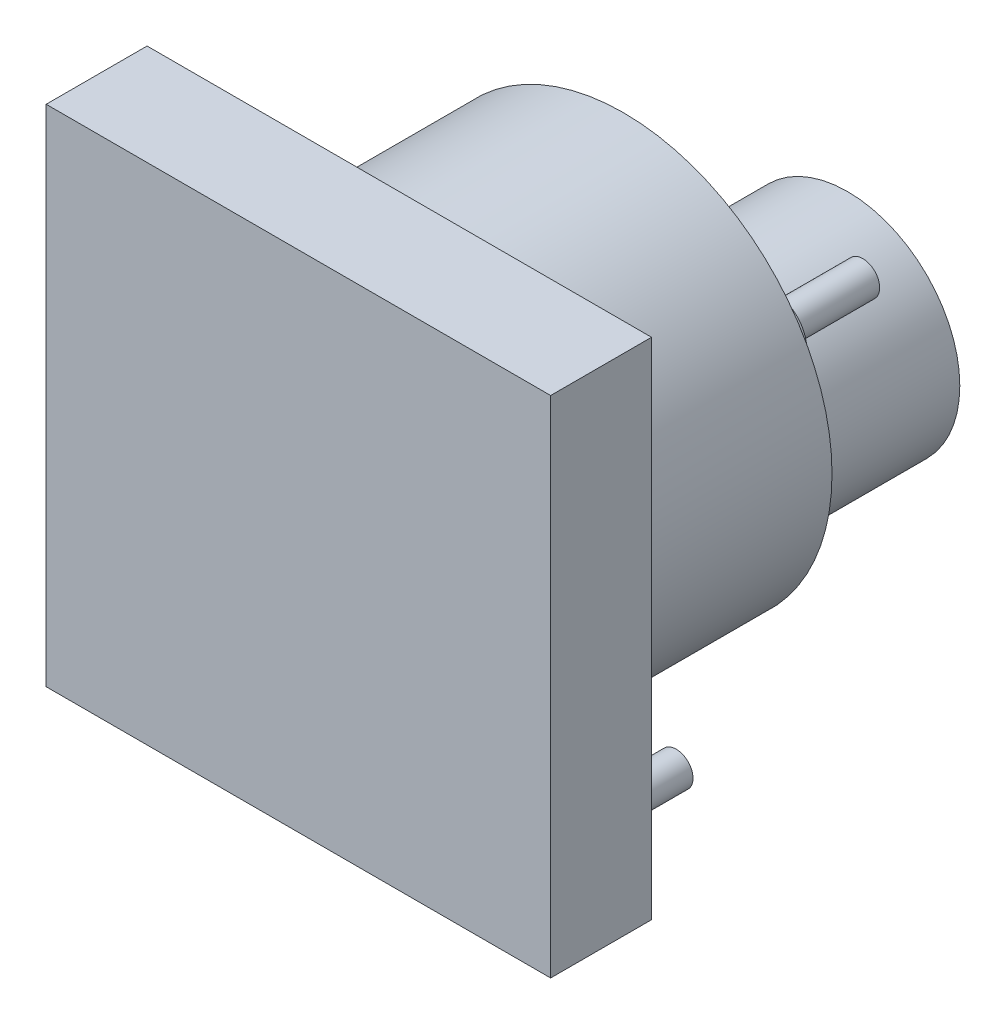
ISO-10303-21;
HEADER;
FILE_DESCRIPTION(('STEP AP214'),'2;1');
FILE_NAME('part.step','',(''),(''),'','','');
FILE_SCHEMA(('AUTOMOTIVE_DESIGN { 1 0 10303 214 1 1 1 1 }'));
ENDSEC;
DATA;
#1=APPLICATION_CONTEXT('core data for automotive mechanical design processes');
#2=APPLICATION_PROTOCOL_DEFINITION('international standard','automotive_design',2000,#1);
#3=PRODUCT_CONTEXT('',#1,'mechanical');
#4=PRODUCT('Part','Part','',(#3));
#5=PRODUCT_RELATED_PRODUCT_CATEGORY('part','',(#4));
#6=PRODUCT_DEFINITION_FORMATION('','',#4);
#7=PRODUCT_DEFINITION_CONTEXT('part definition',#1,'design');
#8=PRODUCT_DEFINITION('design','',#6,#7);
#9=PRODUCT_DEFINITION_SHAPE('','',#8);
#10=(LENGTH_UNIT() NAMED_UNIT(*) SI_UNIT(.MILLI.,.METRE.));
#11=(NAMED_UNIT(*) PLANE_ANGLE_UNIT() SI_UNIT($,.RADIAN.));
#12=(NAMED_UNIT(*) SI_UNIT($,.STERADIAN.) SOLID_ANGLE_UNIT());
#13=UNCERTAINTY_MEASURE_WITH_UNIT(LENGTH_MEASURE(1.E-05),#10,'distance_accuracy_value','');
#14=(GEOMETRIC_REPRESENTATION_CONTEXT(3) GLOBAL_UNCERTAINTY_ASSIGNED_CONTEXT((#13)) GLOBAL_UNIT_ASSIGNED_CONTEXT((#10,
#11,#12)) REPRESENTATION_CONTEXT('',''));
#15=CARTESIAN_POINT('',(0.,0.,0.));
#16=DIRECTION('',(0.,0.,1.));
#17=DIRECTION('',(1.,0.,0.));
#18=AXIS2_PLACEMENT_3D('',#15,#16,#17);
#19=CARTESIAN_POINT('',(0.,0.,-9.));
#20=DIRECTION('',(-1.,0.,0.));
#21=DIRECTION('',(0.,0.,1.));
#22=AXIS2_PLACEMENT_3D('',#19,#20,#21);
#23=PLANE('',#22);
#24=DIRECTION('',(0.,-1.,0.));
#25=VECTOR('',#24,1.);
#26=CARTESIAN_POINT('',(0.,0.,0.));
#27=LINE('',#26,#25);
#28=CARTESIAN_POINT('',(0.,45.,0.));
#29=VERTEX_POINT('',#28);
#30=CARTESIAN_POINT('',(0.,0.,0.));
#31=VERTEX_POINT('',#30);
#32=EDGE_CURVE('E103',#29,#31,#27,.T.);
#33=ORIENTED_EDGE('',*,*,#32,.F.);
#34=DIRECTION('',(0.,0.,1.));
#35=VECTOR('',#34,1.);
#36=CARTESIAN_POINT('',(0.,45.,-9.));
#37=LINE('',#36,#35);
#38=CARTESIAN_POINT('',(0.,45.,-9.));
#39=VERTEX_POINT('',#38);
#40=EDGE_CURVE('E53',#39,#29,#37,.T.);
#41=ORIENTED_EDGE('',*,*,#40,.F.);
#42=DIRECTION('',(0.,-1.,0.));
#43=VECTOR('',#42,1.);
#44=CARTESIAN_POINT('',(0.,0.,-9.));
#45=LINE('',#44,#43);
#46=CARTESIAN_POINT('',(0.,0.,-9.));
#47=VERTEX_POINT('',#46);
#48=EDGE_CURVE('E96',#39,#47,#45,.T.);
#49=ORIENTED_EDGE('',*,*,#48,.T.);
#50=DIRECTION('',(0.,0.,1.));
#51=VECTOR('',#50,1.);
#52=CARTESIAN_POINT('',(0.,0.,-9.));
#53=LINE('',#52,#51);
#54=EDGE_CURVE('E38',#47,#31,#53,.T.);
#55=ORIENTED_EDGE('',*,*,#54,.T.);
#56=EDGE_LOOP('',(#33,#41,#49,#55));
#57=FACE_BOUND('',#56,.T.);
#58=ADVANCED_FACE('F35',(#57),#23,.T.);
#59=CARTESIAN_POINT('',(0.,45.,-9.));
#60=DIRECTION('',(0.,1.,0.));
#61=DIRECTION('',(0.,0.,1.));
#62=AXIS2_PLACEMENT_3D('',#59,#60,#61);
#63=PLANE('',#62);
#64=DIRECTION('',(-1.,0.,0.));
#65=VECTOR('',#64,1.);
#66=CARTESIAN_POINT('',(0.,45.,0.));
#67=LINE('',#66,#65);
#68=CARTESIAN_POINT('',(45.,45.,0.));
#69=VERTEX_POINT('',#68);
#70=EDGE_CURVE('E98',#69,#29,#67,.T.);
#71=ORIENTED_EDGE('',*,*,#70,.F.);
#72=DIRECTION('',(0.,0.,1.));
#73=VECTOR('',#72,1.);
#74=CARTESIAN_POINT('',(45.,45.,-9.));
#75=LINE('',#74,#73);
#76=CARTESIAN_POINT('',(45.,45.,-9.));
#77=VERTEX_POINT('',#76);
#78=EDGE_CURVE('E70',#77,#69,#75,.T.);
#79=ORIENTED_EDGE('',*,*,#78,.F.);
#80=DIRECTION('',(-1.,0.,0.));
#81=VECTOR('',#80,1.);
#82=CARTESIAN_POINT('',(0.,45.,-9.));
#83=LINE('',#82,#81);
#84=EDGE_CURVE('E93',#77,#39,#83,.T.);
#85=ORIENTED_EDGE('',*,*,#84,.T.);
#86=ORIENTED_EDGE('',*,*,#40,.T.);
#87=EDGE_LOOP('',(#71,#79,#85,#86));
#88=FACE_BOUND('',#87,.T.);
#89=ADVANCED_FACE('F191',(#88),#63,.T.);
#90=CARTESIAN_POINT('',(45.,0.,-9.));
#91=DIRECTION('',(1.,0.,0.));
#92=DIRECTION('',(0.,0.,-1.));
#93=AXIS2_PLACEMENT_3D('',#90,#91,#92);
#94=PLANE('',#93);
#95=DIRECTION('',(0.,1.,0.));
#96=VECTOR('',#95,1.);
#97=CARTESIAN_POINT('',(45.,0.,0.));
#98=LINE('',#97,#96);
#99=CARTESIAN_POINT('',(45.,0.,0.));
#100=VERTEX_POINT('',#99);
#101=EDGE_CURVE('E88',#100,#69,#98,.T.);
#102=ORIENTED_EDGE('',*,*,#101,.F.);
#103=DIRECTION('',(0.,0.,1.));
#104=VECTOR('',#103,1.);
#105=CARTESIAN_POINT('',(45.,0.,-9.));
#106=LINE('',#105,#104);
#107=CARTESIAN_POINT('',(45.,0.,-9.));
#108=VERTEX_POINT('',#107);
#109=EDGE_CURVE('E83',#108,#100,#106,.T.);
#110=ORIENTED_EDGE('',*,*,#109,.F.);
#111=DIRECTION('',(0.,1.,0.));
#112=VECTOR('',#111,1.);
#113=CARTESIAN_POINT('',(45.,0.,-9.));
#114=LINE('',#113,#112);
#115=EDGE_CURVE('E86',#108,#77,#114,.T.);
#116=ORIENTED_EDGE('',*,*,#115,.T.);
#117=ORIENTED_EDGE('',*,*,#78,.T.);
#118=EDGE_LOOP('',(#102,#110,#116,#117));
#119=FACE_BOUND('',#118,.T.);
#120=ADVANCED_FACE('F85',(#119),#94,.T.);
#121=CARTESIAN_POINT('',(0.,0.,-9.));
#122=DIRECTION('',(0.,-1.,0.));
#123=DIRECTION('',(0.,0.,-1.));
#124=AXIS2_PLACEMENT_3D('',#121,#122,#123);
#125=PLANE('',#124);
#126=DIRECTION('',(1.,0.,0.));
#127=VECTOR('',#126,1.);
#128=CARTESIAN_POINT('',(0.,0.,0.));
#129=LINE('',#128,#127);
#130=EDGE_CURVE('E106',#31,#100,#129,.T.);
#131=ORIENTED_EDGE('',*,*,#130,.F.);
#132=ORIENTED_EDGE('',*,*,#54,.F.);
#133=DIRECTION('',(1.,0.,0.));
#134=VECTOR('',#133,1.);
#135=CARTESIAN_POINT('',(0.,0.,-9.));
#136=LINE('',#135,#134);
#137=EDGE_CURVE('E92',#47,#108,#136,.T.);
#138=ORIENTED_EDGE('',*,*,#137,.T.);
#139=ORIENTED_EDGE('',*,*,#109,.T.);
#140=EDGE_LOOP('',(#131,#132,#138,#139));
#141=FACE_BOUND('',#140,.T.);
#142=ADVANCED_FACE('F95',(#141),#125,.T.);
#143=CARTESIAN_POINT('',(0.,0.,-9.));
#144=DIRECTION('',(0.,0.,-1.));
#145=DIRECTION('',(-1.,0.,0.));
#146=AXIS2_PLACEMENT_3D('',#143,#144,#145);
#147=PLANE('',#146);
#148=CARTESIAN_POINT('',(5.4,5.18,-9.));
#149=DIRECTION('',(0.,0.,-1.));
#150=DIRECTION('',(-1.,0.,0.));
#151=AXIS2_PLACEMENT_3D('',#148,#149,#150);
#152=CIRCLE('',#151,1.5);
#153=CARTESIAN_POINT('',(6.9,5.18,-9.));
#154=VERTEX_POINT('',#153);
#155=EDGE_CURVE('E153',#154,#154,#152,.T.);
#156=ORIENTED_EDGE('',*,*,#155,.F.);
#157=EDGE_LOOP('',(#156));
#158=FACE_BOUND('',#157,.T.);
#159=CARTESIAN_POINT('',(39.6,5.18,-9.));
#160=DIRECTION('',(0.,0.,-1.));
#161=DIRECTION('',(-1.,0.,0.));
#162=AXIS2_PLACEMENT_3D('',#159,#160,#161);
#163=CIRCLE('',#162,1.5);
#164=CARTESIAN_POINT('',(41.1,5.18,-9.));
#165=VERTEX_POINT('',#164);
#166=EDGE_CURVE('E147',#165,#165,#163,.T.);
#167=ORIENTED_EDGE('',*,*,#166,.F.);
#168=EDGE_LOOP('',(#167));
#169=FACE_BOUND('',#168,.T.);
#170=CARTESIAN_POINT('',(22.5,22.5,-9.));
#171=DIRECTION('',(0.,0.,-1.));
#172=DIRECTION('',(-1.,0.,0.));
#173=AXIS2_PLACEMENT_3D('',#170,#171,#172);
#174=CIRCLE('',#173,18.6);
#175=CARTESIAN_POINT('',(3.9,22.5,-9.));
#176=VERTEX_POINT('',#175);
#177=EDGE_CURVE('E113',#176,#176,#174,.T.);
#178=ORIENTED_EDGE('',*,*,#177,.F.);
#179=EDGE_LOOP('',(#178));
#180=FACE_BOUND('',#179,.T.);
#181=ORIENTED_EDGE('',*,*,#48,.F.);
#182=ORIENTED_EDGE('',*,*,#84,.F.);
#183=ORIENTED_EDGE('',*,*,#115,.F.);
#184=ORIENTED_EDGE('',*,*,#137,.F.);
#185=EDGE_LOOP('',(#181,#182,#183,#184));
#186=FACE_BOUND('',#185,.T.);
#187=ADVANCED_FACE('F91',(#158,#169,#180,#186),#147,.T.);
#188=CARTESIAN_POINT('',(0.,0.,0.));
#189=DIRECTION('',(0.,0.,-1.));
#190=DIRECTION('',(-1.,0.,0.));
#191=AXIS2_PLACEMENT_3D('',#188,#189,#190);
#192=PLANE('',#191);
#193=ORIENTED_EDGE('',*,*,#32,.T.);
#194=ORIENTED_EDGE('',*,*,#130,.T.);
#195=ORIENTED_EDGE('',*,*,#101,.T.);
#196=ORIENTED_EDGE('',*,*,#70,.T.);
#197=EDGE_LOOP('',(#193,#194,#195,#196));
#198=FACE_BOUND('',#197,.T.);
#199=ADVANCED_FACE('F170',(#198),#192,.F.);
#200=CARTESIAN_POINT('',(22.5,22.5,-29.));
#201=DIRECTION('',(0.,0.,1.));
#202=DIRECTION('',(1.,0.,0.));
#203=AXIS2_PLACEMENT_3D('',#200,#201,#202);
#204=CYLINDRICAL_SURFACE('',#203,18.6);
#205=CARTESIAN_POINT('',(22.5,22.5,-29.));
#206=DIRECTION('',(0.,0.,-1.));
#207=DIRECTION('',(-1.,0.,0.));
#208=AXIS2_PLACEMENT_3D('',#205,#206,#207);
#209=CIRCLE('',#208,18.6);
#210=CARTESIAN_POINT('',(3.9,22.5,-29.));
#211=VERTEX_POINT('',#210);
#212=EDGE_CURVE('E107',#211,#211,#209,.T.);
#213=ORIENTED_EDGE('',*,*,#212,.F.);
#214=EDGE_LOOP('',(#213));
#215=FACE_BOUND('',#214,.T.);
#216=ORIENTED_EDGE('',*,*,#177,.T.);
#217=EDGE_LOOP('',(#216));
#218=FACE_BOUND('',#217,.T.);
#219=ADVANCED_FACE('F198',(#215,#218),#204,.T.);
#220=CARTESIAN_POINT('',(22.5,22.5,-29.));
#221=DIRECTION('',(0.,0.,-1.));
#222=DIRECTION('',(-1.,0.,0.));
#223=AXIS2_PLACEMENT_3D('',#220,#221,#222);
#224=PLANE('',#223);
#225=CARTESIAN_POINT('',(22.5,15.,-29.));
#226=DIRECTION('',(0.,0.,-1.));
#227=DIRECTION('',(-1.,0.,0.));
#228=AXIS2_PLACEMENT_3D('',#225,#226,#227);
#229=CIRCLE('',#228,10.);
#230=CARTESIAN_POINT('',(12.5,15.,-29.));
#231=VERTEX_POINT('',#230);
#232=EDGE_CURVE('E141',#231,#231,#229,.T.);
#233=ORIENTED_EDGE('',*,*,#232,.F.);
#234=EDGE_LOOP('',(#233));
#235=FACE_BOUND('',#234,.T.);
#236=CARTESIAN_POINT('',(11.15,29.,-29.));
#237=DIRECTION('',(0.,0.,-1.));
#238=DIRECTION('',(-1.,0.,0.));
#239=AXIS2_PLACEMENT_3D('',#236,#237,#238);
#240=CIRCLE('',#239,3.);
#241=CARTESIAN_POINT('',(8.15,29.,-29.));
#242=VERTEX_POINT('',#241);
#243=EDGE_CURVE('E129',#242,#242,#240,.T.);
#244=ORIENTED_EDGE('',*,*,#243,.F.);
#245=EDGE_LOOP('',(#244));
#246=FACE_BOUND('',#245,.T.);
#247=CARTESIAN_POINT('',(33.85,29.,-29.));
#248=DIRECTION('',(0.,0.,-1.));
#249=DIRECTION('',(-1.,0.,0.));
#250=AXIS2_PLACEMENT_3D('',#247,#248,#249);
#251=CIRCLE('',#250,3.);
#252=CARTESIAN_POINT('',(30.85,29.,-29.));
#253=VERTEX_POINT('',#252);
#254=EDGE_CURVE('E123',#253,#253,#251,.T.);
#255=ORIENTED_EDGE('',*,*,#254,.F.);
#256=EDGE_LOOP('',(#255));
#257=FACE_BOUND('',#256,.T.);
#258=ORIENTED_EDGE('',*,*,#212,.T.);
#259=EDGE_LOOP('',(#258));
#260=FACE_BOUND('',#259,.T.);
#261=ADVANCED_FACE('F203',(#235,#246,#257,#260),#224,.T.);
#262=CARTESIAN_POINT('',(33.85,29.,-31.));
#263=DIRECTION('',(0.,0.,1.));
#264=DIRECTION('',(1.,0.,0.));
#265=AXIS2_PLACEMENT_3D('',#262,#263,#264);
#266=CYLINDRICAL_SURFACE('',#265,3.);
#267=CARTESIAN_POINT('',(33.85,29.,-31.));
#268=DIRECTION('',(0.,0.,-1.));
#269=DIRECTION('',(-1.,0.,0.));
#270=AXIS2_PLACEMENT_3D('',#267,#268,#269);
#271=CIRCLE('',#270,3.);
#272=CARTESIAN_POINT('',(30.85,29.,-31.));
#273=VERTEX_POINT('',#272);
#274=EDGE_CURVE('E122',#273,#273,#271,.T.);
#275=ORIENTED_EDGE('',*,*,#274,.F.);
#276=EDGE_LOOP('',(#275));
#277=FACE_BOUND('',#276,.T.);
#278=ORIENTED_EDGE('',*,*,#254,.T.);
#279=EDGE_LOOP('',(#278));
#280=FACE_BOUND('',#279,.T.);
#281=ADVANCED_FACE('F322',(#277,#280),#266,.T.);
#282=CARTESIAN_POINT('',(33.85,29.,-31.));
#283=DIRECTION('',(0.,0.,-1.));
#284=DIRECTION('',(-1.,0.,0.));
#285=AXIS2_PLACEMENT_3D('',#282,#283,#284);
#286=PLANE('',#285);
#287=CARTESIAN_POINT('',(33.85,29.,-31.));
#288=DIRECTION('',(0.,0.,-1.));
#289=DIRECTION('',(-1.,0.,0.));
#290=AXIS2_PLACEMENT_3D('',#287,#288,#289);
#291=CIRCLE('',#290,1.5);
#292=CARTESIAN_POINT('',(32.35,29.,-31.));
#293=VERTEX_POINT('',#292);
#294=EDGE_CURVE('E44',#293,#293,#291,.T.);
#295=ORIENTED_EDGE('',*,*,#294,.F.);
#296=EDGE_LOOP('',(#295));
#297=FACE_BOUND('',#296,.T.);
#298=ORIENTED_EDGE('',*,*,#274,.T.);
#299=EDGE_LOOP('',(#298));
#300=FACE_BOUND('',#299,.T.);
#301=ADVANCED_FACE('F313',(#297,#300),#286,.T.);
#302=CARTESIAN_POINT('',(11.15,29.,-31.));
#303=DIRECTION('',(0.,0.,1.));
#304=DIRECTION('',(1.,0.,0.));
#305=AXIS2_PLACEMENT_3D('',#302,#303,#304);
#306=CYLINDRICAL_SURFACE('',#305,3.);
#307=CARTESIAN_POINT('',(11.15,29.,-31.));
#308=DIRECTION('',(0.,0.,-1.));
#309=DIRECTION('',(-1.,0.,0.));
#310=AXIS2_PLACEMENT_3D('',#307,#308,#309);
#311=CIRCLE('',#310,3.);
#312=CARTESIAN_POINT('',(8.15,29.,-31.));
#313=VERTEX_POINT('',#312);
#314=EDGE_CURVE('E126',#313,#313,#311,.T.);
#315=ORIENTED_EDGE('',*,*,#314,.F.);
#316=EDGE_LOOP('',(#315));
#317=FACE_BOUND('',#316,.T.);
#318=ORIENTED_EDGE('',*,*,#243,.T.);
#319=EDGE_LOOP('',(#318));
#320=FACE_BOUND('',#319,.T.);
#321=ADVANCED_FACE('F303',(#317,#320),#306,.T.);
#322=CARTESIAN_POINT('',(11.15,29.,-31.));
#323=DIRECTION('',(0.,0.,-1.));
#324=DIRECTION('',(-1.,0.,0.));
#325=AXIS2_PLACEMENT_3D('',#322,#323,#324);
#326=PLANE('',#325);
#327=CARTESIAN_POINT('',(11.15,29.,-31.));
#328=DIRECTION('',(0.,0.,-1.));
#329=DIRECTION('',(-1.,0.,0.));
#330=AXIS2_PLACEMENT_3D('',#327,#328,#329);
#331=CIRCLE('',#330,1.5);
#332=CARTESIAN_POINT('',(9.65,29.,-31.));
#333=VERTEX_POINT('',#332);
#334=EDGE_CURVE('E11',#333,#333,#331,.T.);
#335=ORIENTED_EDGE('',*,*,#334,.F.);
#336=EDGE_LOOP('',(#335));
#337=FACE_BOUND('',#336,.T.);
#338=ORIENTED_EDGE('',*,*,#314,.T.);
#339=EDGE_LOOP('',(#338));
#340=FACE_BOUND('',#339,.T.);
#341=ADVANCED_FACE('F294',(#337,#340),#326,.T.);
#342=CARTESIAN_POINT('',(33.85,29.,-39.));
#343=DIRECTION('',(0.,0.,1.));
#344=DIRECTION('',(1.,0.,0.));
#345=AXIS2_PLACEMENT_3D('',#342,#343,#344);
#346=CYLINDRICAL_SURFACE('',#345,1.5);
#347=CARTESIAN_POINT('',(33.85,29.,-39.));
#348=DIRECTION('',(0.,0.,-1.));
#349=DIRECTION('',(-1.,0.,0.));
#350=AXIS2_PLACEMENT_3D('',#347,#348,#349);
#351=CIRCLE('',#350,1.5);
#352=CARTESIAN_POINT('',(32.35,29.,-39.));
#353=VERTEX_POINT('',#352);
#354=EDGE_CURVE('E132',#353,#353,#351,.T.);
#355=ORIENTED_EDGE('',*,*,#354,.F.);
#356=EDGE_LOOP('',(#355));
#357=FACE_BOUND('',#356,.T.);
#358=ORIENTED_EDGE('',*,*,#294,.T.);
#359=EDGE_LOOP('',(#358));
#360=FACE_BOUND('',#359,.T.);
#361=ADVANCED_FACE('F285',(#357,#360),#346,.T.);
#362=CARTESIAN_POINT('',(33.85,29.,-39.));
#363=DIRECTION('',(0.,0.,-1.));
#364=DIRECTION('',(-1.,0.,0.));
#365=AXIS2_PLACEMENT_3D('',#362,#363,#364);
#366=PLANE('',#365);
#367=ORIENTED_EDGE('',*,*,#354,.T.);
#368=EDGE_LOOP('',(#367));
#369=FACE_BOUND('',#368,.T.);
#370=ADVANCED_FACE('F276',(#369),#366,.T.);
#371=CARTESIAN_POINT('',(11.15,29.,-39.));
#372=DIRECTION('',(0.,0.,1.));
#373=DIRECTION('',(1.,0.,0.));
#374=AXIS2_PLACEMENT_3D('',#371,#372,#373);
#375=CYLINDRICAL_SURFACE('',#374,1.5);
#376=CARTESIAN_POINT('',(11.15,29.,-39.));
#377=DIRECTION('',(0.,0.,-1.));
#378=DIRECTION('',(-1.,0.,0.));
#379=AXIS2_PLACEMENT_3D('',#376,#377,#378);
#380=CIRCLE('',#379,1.5);
#381=CARTESIAN_POINT('',(9.65,29.,-39.));
#382=VERTEX_POINT('',#381);
#383=EDGE_CURVE('E136',#382,#382,#380,.T.);
#384=ORIENTED_EDGE('',*,*,#383,.F.);
#385=EDGE_LOOP('',(#384));
#386=FACE_BOUND('',#385,.T.);
#387=ORIENTED_EDGE('',*,*,#334,.T.);
#388=EDGE_LOOP('',(#387));
#389=FACE_BOUND('',#388,.T.);
#390=ADVANCED_FACE('F267',(#386,#389),#375,.T.);
#391=CARTESIAN_POINT('',(11.15,29.,-39.));
#392=DIRECTION('',(0.,0.,-1.));
#393=DIRECTION('',(-1.,0.,0.));
#394=AXIS2_PLACEMENT_3D('',#391,#392,#393);
#395=PLANE('',#394);
#396=ORIENTED_EDGE('',*,*,#383,.T.);
#397=EDGE_LOOP('',(#396));
#398=FACE_BOUND('',#397,.T.);
#399=ADVANCED_FACE('F257',(#398),#395,.T.);
#400=CARTESIAN_POINT('',(22.5,15.,-49.));
#401=DIRECTION('',(0.,0.,1.));
#402=DIRECTION('',(1.,0.,0.));
#403=AXIS2_PLACEMENT_3D('',#400,#401,#402);
#404=CYLINDRICAL_SURFACE('',#403,10.);
#405=CARTESIAN_POINT('',(22.5,15.,-49.));
#406=DIRECTION('',(0.,0.,-1.));
#407=DIRECTION('',(-1.,0.,0.));
#408=AXIS2_PLACEMENT_3D('',#405,#406,#407);
#409=CIRCLE('',#408,10.);
#410=CARTESIAN_POINT('',(12.5,15.,-49.));
#411=VERTEX_POINT('',#410);
#412=EDGE_CURVE('E140',#411,#411,#409,.T.);
#413=ORIENTED_EDGE('',*,*,#412,.F.);
#414=EDGE_LOOP('',(#413));
#415=FACE_BOUND('',#414,.T.);
#416=ORIENTED_EDGE('',*,*,#232,.T.);
#417=EDGE_LOOP('',(#416));
#418=FACE_BOUND('',#417,.T.);
#419=ADVANCED_FACE('F186',(#415,#418),#404,.T.);
#420=CARTESIAN_POINT('',(22.5,15.,-49.));
#421=DIRECTION('',(0.,0.,-1.));
#422=DIRECTION('',(-1.,0.,0.));
#423=AXIS2_PLACEMENT_3D('',#420,#421,#422);
#424=PLANE('',#423);
#425=ORIENTED_EDGE('',*,*,#412,.T.);
#426=EDGE_LOOP('',(#425));
#427=FACE_BOUND('',#426,.T.);
#428=ADVANCED_FACE('F177',(#427),#424,.T.);
#429=CARTESIAN_POINT('',(39.6,5.18,-16.6));
#430=DIRECTION('',(0.,0.,1.));
#431=DIRECTION('',(1.,0.,0.));
#432=AXIS2_PLACEMENT_3D('',#429,#430,#431);
#433=CYLINDRICAL_SURFACE('',#432,1.5);
#434=CARTESIAN_POINT('',(39.6,5.18,-16.6));
#435=DIRECTION('',(0.,0.,-1.));
#436=DIRECTION('',(-1.,0.,0.));
#437=AXIS2_PLACEMENT_3D('',#434,#435,#436);
#438=CIRCLE('',#437,1.5);
#439=CARTESIAN_POINT('',(41.1,5.18,-16.6));
#440=VERTEX_POINT('',#439);
#441=EDGE_CURVE('E144',#440,#440,#438,.T.);
#442=CARTESIAN_POINT('',(41.1,5.18,-16.6));
#443=CARTESIAN_POINT('',(41.1,5.18,-16.5208333333333));
#444=CARTESIAN_POINT('',(41.1,5.18,-16.4416666666667));
#445=CARTESIAN_POINT('',(41.1,5.18,-16.2833333333333));
#446=CARTESIAN_POINT('',(41.1,5.18,-16.2041666666667));
#447=CARTESIAN_POINT('',(41.1,5.18,-16.0458333333333));
#448=CARTESIAN_POINT('',(41.1,5.18,-15.9666666666667));
#449=CARTESIAN_POINT('',(41.1,5.18,-15.8083333333333));
#450=CARTESIAN_POINT('',(41.1,5.18,-15.7291666666667));
#451=CARTESIAN_POINT('',(41.1,5.18,-15.5708333333333));
#452=CARTESIAN_POINT('',(41.1,5.18,-15.4916666666667));
#453=CARTESIAN_POINT('',(41.1,5.18,-15.3333333333333));
#454=CARTESIAN_POINT('',(41.1,5.18,-15.2541666666667));
#455=CARTESIAN_POINT('',(41.1,5.18,-15.0958333333333));
#456=CARTESIAN_POINT('',(41.1,5.18,-15.0166666666667));
#457=CARTESIAN_POINT('',(41.1,5.18,-14.8583333333333));
#458=CARTESIAN_POINT('',(41.1,5.18,-14.7791666666667));
#459=CARTESIAN_POINT('',(41.1,5.18,-14.6208333333333));
#460=CARTESIAN_POINT('',(41.1,5.18,-14.5416666666667));
#461=CARTESIAN_POINT('',(41.1,5.18,-14.3833333333333));
#462=CARTESIAN_POINT('',(41.1,5.18,-14.3041666666667));
#463=CARTESIAN_POINT('',(41.1,5.18,-14.1458333333333));
#464=CARTESIAN_POINT('',(41.1,5.18,-14.0666666666667));
#465=CARTESIAN_POINT('',(41.1,5.18,-13.9083333333333));
#466=CARTESIAN_POINT('',(41.1,5.18,-13.8291666666667));
#467=CARTESIAN_POINT('',(41.1,5.18,-13.6708333333333));
#468=CARTESIAN_POINT('',(41.1,5.18,-13.5916666666667));
#469=CARTESIAN_POINT('',(41.1,5.18,-13.4333333333333));
#470=CARTESIAN_POINT('',(41.1,5.18,-13.3541666666667));
#471=CARTESIAN_POINT('',(41.1,5.18,-13.1958333333333));
#472=CARTESIAN_POINT('',(41.1,5.18,-13.1166666666667));
#473=CARTESIAN_POINT('',(41.1,5.18,-12.9583333333333));
#474=CARTESIAN_POINT('',(41.1,5.18,-12.8791666666667));
#475=CARTESIAN_POINT('',(41.1,5.18,-12.7208333333333));
#476=CARTESIAN_POINT('',(41.1,5.18,-12.6416666666667));
#477=CARTESIAN_POINT('',(41.1,5.18,-12.4833333333333));
#478=CARTESIAN_POINT('',(41.1,5.18,-12.4041666666667));
#479=CARTESIAN_POINT('',(41.1,5.18,-12.2458333333333));
#480=CARTESIAN_POINT('',(41.1,5.18,-12.1666666666667));
#481=CARTESIAN_POINT('',(41.1,5.18,-12.0083333333333));
#482=CARTESIAN_POINT('',(41.1,5.18,-11.9291666666667));
#483=CARTESIAN_POINT('',(41.1,5.18,-11.7708333333333));
#484=CARTESIAN_POINT('',(41.1,5.18,-11.6916666666667));
#485=CARTESIAN_POINT('',(41.1,5.18,-11.5333333333333));
#486=CARTESIAN_POINT('',(41.1,5.18,-11.4541666666667));
#487=CARTESIAN_POINT('',(41.1,5.18,-11.2958333333333));
#488=CARTESIAN_POINT('',(41.1,5.18,-11.2166666666667));
#489=CARTESIAN_POINT('',(41.1,5.18,-11.0583333333333));
#490=CARTESIAN_POINT('',(41.1,5.18,-10.9791666666667));
#491=CARTESIAN_POINT('',(41.1,5.18,-10.8208333333333));
#492=CARTESIAN_POINT('',(41.1,5.18,-10.7416666666667));
#493=CARTESIAN_POINT('',(41.1,5.18,-10.5833333333333));
#494=CARTESIAN_POINT('',(41.1,5.18,-10.5041666666667));
#495=CARTESIAN_POINT('',(41.1,5.18,-10.3458333333333));
#496=CARTESIAN_POINT('',(41.1,5.18,-10.2666666666667));
#497=CARTESIAN_POINT('',(41.1,5.18,-10.1083333333333));
#498=CARTESIAN_POINT('',(41.1,5.18,-10.0291666666667));
#499=CARTESIAN_POINT('',(41.1,5.18,-9.87083333333333));
#500=CARTESIAN_POINT('',(41.1,5.18,-9.79166666666667));
#501=CARTESIAN_POINT('',(41.1,5.18,-9.63333333333333));
#502=CARTESIAN_POINT('',(41.1,5.18,-9.55416666666666));
#503=CARTESIAN_POINT('',(41.1,5.18,-9.39583333333333));
#504=CARTESIAN_POINT('',(41.1,5.18,-9.31666666666667));
#505=CARTESIAN_POINT('',(41.1,5.18,-9.15833333333333));
#506=CARTESIAN_POINT('',(41.1,5.18,-9.07916666666666));
#507=CARTESIAN_POINT('',(41.1,5.18,-9.));
#508=B_SPLINE_CURVE_WITH_KNOTS('',3,(#442,#443,#444,#445,#446,#447,#448,#449,#450,#451,#452,
#453,#454,#455,#456,#457,#458,#459,#460,#461,#462,#463,#464,#465,#466,#467,#468,#469,#470,#471,
#472,#473,#474,#475,#476,#477,#478,#479,#480,#481,#482,#483,#484,#485,#486,#487,#488,#489,#490,
#491,#492,#493,#494,#495,#496,#497,#498,#499,#500,#501,#502,#503,#504,#505,#506,#507),
.UNSPECIFIED.,.F.,.F.,(4,2,2,2,2,2,2,2,2,2,2,2,2,2,2,2,2,2,2,2,2,2,2,2,2,2,2,2,2,2,2,2,4),(0.,
0.237500000000002,0.475000000000003,0.712500000000001,0.950000000000003,1.1875,1.425,1.6625,1.9,
2.1375,2.375,2.6125,2.85,3.0875,3.325,3.5625,3.8,4.0375,4.275,4.5125,4.75,4.9875,5.225,5.4625,
5.7,5.9375,6.175,6.4125,6.65,6.8875,7.125,7.3625,7.6),.UNSPECIFIED.);
#509=EDGE_CURVE('BSEAM175',#440,#165,#508,.T.);
#510=ORIENTED_EDGE('',*,*,#441,.F.);
#511=ORIENTED_EDGE('',*,*,#166,.T.);
#512=ORIENTED_EDGE('',*,*,#509,.T.);
#513=ORIENTED_EDGE('',*,*,#509,.F.);
#514=EDGE_LOOP('',(#510,#512,#511,#513));
#515=FACE_BOUND('',#514,.T.);
#516=ADVANCED_FACE('F175',(#515),#433,.T.);
#517=CARTESIAN_POINT('',(39.6,5.18,-16.6));
#518=DIRECTION('',(0.,0.,-1.));
#519=DIRECTION('',(-1.,0.,0.));
#520=AXIS2_PLACEMENT_3D('',#517,#518,#519);
#521=PLANE('',#520);
#522=ORIENTED_EDGE('',*,*,#441,.T.);
#523=EDGE_LOOP('',(#522));
#524=FACE_BOUND('',#523,.T.);
#525=ADVANCED_FACE('F164',(#524),#521,.T.);
#526=CARTESIAN_POINT('',(5.4,5.18,-16.6));
#527=DIRECTION('',(0.,0.,1.));
#528=DIRECTION('',(1.,0.,0.));
#529=AXIS2_PLACEMENT_3D('',#526,#527,#528);
#530=CYLINDRICAL_SURFACE('',#529,1.5);
#531=CARTESIAN_POINT('',(5.4,5.18,-16.6));
#532=DIRECTION('',(0.,0.,-1.));
#533=DIRECTION('',(-1.,0.,0.));
#534=AXIS2_PLACEMENT_3D('',#531,#532,#533);
#535=CIRCLE('',#534,1.5);
#536=CARTESIAN_POINT('',(6.9,5.18,-16.6));
#537=VERTEX_POINT('',#536);
#538=EDGE_CURVE('E150',#537,#537,#535,.T.);
#539=CARTESIAN_POINT('',(6.9,5.18,-16.6));
#540=CARTESIAN_POINT('',(6.9,5.18,-16.5208333333333));
#541=CARTESIAN_POINT('',(6.9,5.18,-16.4416666666667));
#542=CARTESIAN_POINT('',(6.9,5.18,-16.2833333333333));
#543=CARTESIAN_POINT('',(6.9,5.18,-16.2041666666667));
#544=CARTESIAN_POINT('',(6.9,5.18,-16.0458333333333));
#545=CARTESIAN_POINT('',(6.9,5.18,-15.9666666666667));
#546=CARTESIAN_POINT('',(6.9,5.18,-15.8083333333333));
#547=CARTESIAN_POINT('',(6.9,5.18,-15.7291666666667));
#548=CARTESIAN_POINT('',(6.9,5.18,-15.5708333333333));
#549=CARTESIAN_POINT('',(6.9,5.18,-15.4916666666667));
#550=CARTESIAN_POINT('',(6.9,5.18,-15.3333333333333));
#551=CARTESIAN_POINT('',(6.9,5.18,-15.2541666666667));
#552=CARTESIAN_POINT('',(6.9,5.18,-15.0958333333333));
#553=CARTESIAN_POINT('',(6.9,5.18,-15.0166666666667));
#554=CARTESIAN_POINT('',(6.9,5.18,-14.8583333333333));
#555=CARTESIAN_POINT('',(6.9,5.18,-14.7791666666667));
#556=CARTESIAN_POINT('',(6.9,5.18,-14.6208333333333));
#557=CARTESIAN_POINT('',(6.9,5.18,-14.5416666666667));
#558=CARTESIAN_POINT('',(6.9,5.18,-14.3833333333333));
#559=CARTESIAN_POINT('',(6.9,5.18,-14.3041666666667));
#560=CARTESIAN_POINT('',(6.9,5.18,-14.1458333333333));
#561=CARTESIAN_POINT('',(6.9,5.18,-14.0666666666667));
#562=CARTESIAN_POINT('',(6.9,5.18,-13.9083333333333));
#563=CARTESIAN_POINT('',(6.9,5.18,-13.8291666666667));
#564=CARTESIAN_POINT('',(6.9,5.18,-13.6708333333333));
#565=CARTESIAN_POINT('',(6.9,5.18,-13.5916666666667));
#566=CARTESIAN_POINT('',(6.9,5.18,-13.4333333333333));
#567=CARTESIAN_POINT('',(6.9,5.18,-13.3541666666667));
#568=CARTESIAN_POINT('',(6.9,5.18,-13.1958333333333));
#569=CARTESIAN_POINT('',(6.9,5.18,-13.1166666666667));
#570=CARTESIAN_POINT('',(6.9,5.18,-12.9583333333333));
#571=CARTESIAN_POINT('',(6.9,5.18,-12.8791666666667));
#572=CARTESIAN_POINT('',(6.9,5.18,-12.7208333333333));
#573=CARTESIAN_POINT('',(6.9,5.18,-12.6416666666667));
#574=CARTESIAN_POINT('',(6.9,5.18,-12.4833333333333));
#575=CARTESIAN_POINT('',(6.9,5.18,-12.4041666666667));
#576=CARTESIAN_POINT('',(6.9,5.18,-12.2458333333333));
#577=CARTESIAN_POINT('',(6.9,5.18,-12.1666666666667));
#578=CARTESIAN_POINT('',(6.9,5.18,-12.0083333333333));
#579=CARTESIAN_POINT('',(6.9,5.18,-11.9291666666667));
#580=CARTESIAN_POINT('',(6.9,5.18,-11.7708333333333));
#581=CARTESIAN_POINT('',(6.9,5.18,-11.6916666666667));
#582=CARTESIAN_POINT('',(6.9,5.18,-11.5333333333333));
#583=CARTESIAN_POINT('',(6.9,5.18,-11.4541666666667));
#584=CARTESIAN_POINT('',(6.9,5.18,-11.2958333333333));
#585=CARTESIAN_POINT('',(6.9,5.18,-11.2166666666667));
#586=CARTESIAN_POINT('',(6.9,5.18,-11.0583333333333));
#587=CARTESIAN_POINT('',(6.9,5.18,-10.9791666666667));
#588=CARTESIAN_POINT('',(6.9,5.18,-10.8208333333333));
#589=CARTESIAN_POINT('',(6.9,5.18,-10.7416666666667));
#590=CARTESIAN_POINT('',(6.9,5.18,-10.5833333333333));
#591=CARTESIAN_POINT('',(6.9,5.18,-10.5041666666667));
#592=CARTESIAN_POINT('',(6.9,5.18,-10.3458333333333));
#593=CARTESIAN_POINT('',(6.9,5.18,-10.2666666666667));
#594=CARTESIAN_POINT('',(6.9,5.18,-10.1083333333333));
#595=CARTESIAN_POINT('',(6.9,5.18,-10.0291666666667));
#596=CARTESIAN_POINT('',(6.9,5.18,-9.87083333333333));
#597=CARTESIAN_POINT('',(6.9,5.18,-9.79166666666667));
#598=CARTESIAN_POINT('',(6.9,5.18,-9.63333333333333));
#599=CARTESIAN_POINT('',(6.9,5.18,-9.55416666666666));
#600=CARTESIAN_POINT('',(6.9,5.18,-9.39583333333333));
#601=CARTESIAN_POINT('',(6.9,5.18,-9.31666666666667));
#602=CARTESIAN_POINT('',(6.9,5.18,-9.15833333333333));
#603=CARTESIAN_POINT('',(6.9,5.18,-9.07916666666666));
#604=CARTESIAN_POINT('',(6.9,5.18,-9.));
#605=B_SPLINE_CURVE_WITH_KNOTS('',3,(#539,#540,#541,#542,#543,#544,#545,#546,#547,#548,#549,
#550,#551,#552,#553,#554,#555,#556,#557,#558,#559,#560,#561,#562,#563,#564,#565,#566,#567,#568,
#569,#570,#571,#572,#573,#574,#575,#576,#577,#578,#579,#580,#581,#582,#583,#584,#585,#586,#587,
#588,#589,#590,#591,#592,#593,#594,#595,#596,#597,#598,#599,#600,#601,#602,#603,#604),
.UNSPECIFIED.,.F.,.F.,(4,2,2,2,2,2,2,2,2,2,2,2,2,2,2,2,2,2,2,2,2,2,2,2,2,2,2,2,2,2,2,2,4),(0.,
0.237500000000002,0.475000000000003,0.712500000000001,0.950000000000003,1.1875,1.425,1.6625,1.9,
2.1375,2.375,2.6125,2.85,3.0875,3.325,3.5625,3.8,4.0375,4.275,4.5125,4.75,4.9875,5.225,5.4625,
5.7,5.9375,6.175,6.4125,6.65,6.8875,7.125,7.3625,7.6),.UNSPECIFIED.);
#606=EDGE_CURVE('BSEAM161',#537,#154,#605,.T.);
#607=ORIENTED_EDGE('',*,*,#538,.F.);
#608=ORIENTED_EDGE('',*,*,#155,.T.);
#609=ORIENTED_EDGE('',*,*,#606,.T.);
#610=ORIENTED_EDGE('',*,*,#606,.F.);
#611=EDGE_LOOP('',(#607,#609,#608,#610));
#612=FACE_BOUND('',#611,.T.);
#613=ADVANCED_FACE('F161',(#612),#530,.T.);
#614=CARTESIAN_POINT('',(5.4,5.18,-16.6));
#615=DIRECTION('',(0.,0.,-1.));
#616=DIRECTION('',(-1.,0.,0.));
#617=AXIS2_PLACEMENT_3D('',#614,#615,#616);
#618=PLANE('',#617);
#619=ORIENTED_EDGE('',*,*,#538,.T.);
#620=EDGE_LOOP('',(#619));
#621=FACE_BOUND('',#620,.T.);
#622=ADVANCED_FACE('F159',(#621),#618,.T.);
#623=CLOSED_SHELL('',(#58,#89,#120,#142,#187,#199,#219,#261,#281,#301,#321,#341,#361,#370,#390,
#399,#419,#428,#516,#525,#613,#622));
#624=MANIFOLD_SOLID_BREP('B2',#623);
#625=ADVANCED_BREP_SHAPE_REPRESENTATION('',(#18,#624),#14);
#626=SHAPE_DEFINITION_REPRESENTATION(#9,#625);
ENDSEC;
END-ISO-10303-21;
